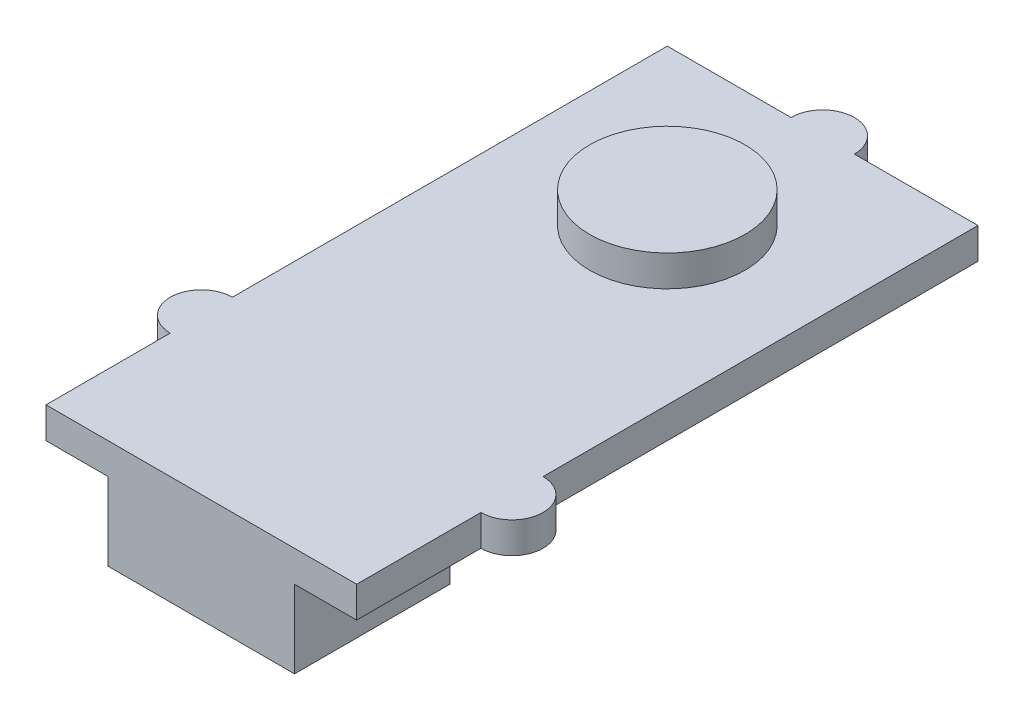
ISO-10303-21;
HEADER;
FILE_DESCRIPTION(('STEP AP214'),'2;1');
FILE_NAME('part.step','',(''),(''),'','','');
FILE_SCHEMA(('AUTOMOTIVE_DESIGN { 1 0 10303 214 1 1 1 1 }'));
ENDSEC;
DATA;
#1=APPLICATION_CONTEXT('core data for automotive mechanical design processes');
#2=APPLICATION_PROTOCOL_DEFINITION('international standard','automotive_design',2000,#1);
#3=PRODUCT_CONTEXT('',#1,'mechanical');
#4=PRODUCT('Part','Part','',(#3));
#5=PRODUCT_RELATED_PRODUCT_CATEGORY('part','',(#4));
#6=PRODUCT_DEFINITION_FORMATION('','',#4);
#7=PRODUCT_DEFINITION_CONTEXT('part definition',#1,'design');
#8=PRODUCT_DEFINITION('design','',#6,#7);
#9=PRODUCT_DEFINITION_SHAPE('','',#8);
#10=(LENGTH_UNIT() NAMED_UNIT(*) SI_UNIT(.MILLI.,.METRE.));
#11=(NAMED_UNIT(*) PLANE_ANGLE_UNIT() SI_UNIT($,.RADIAN.));
#12=(NAMED_UNIT(*) SI_UNIT($,.STERADIAN.) SOLID_ANGLE_UNIT());
#13=UNCERTAINTY_MEASURE_WITH_UNIT(LENGTH_MEASURE(1.E-05),#10,'distance_accuracy_value','');
#14=(GEOMETRIC_REPRESENTATION_CONTEXT(3) GLOBAL_UNCERTAINTY_ASSIGNED_CONTEXT((#13)) GLOBAL_UNIT_ASSIGNED_CONTEXT((#10,
#11,#12)) REPRESENTATION_CONTEXT('',''));
#15=CARTESIAN_POINT('',(0.,0.,0.));
#16=DIRECTION('',(0.,0.,1.));
#17=DIRECTION('',(1.,0.,0.));
#18=AXIS2_PLACEMENT_3D('',#15,#16,#17);
#19=CARTESIAN_POINT('',(-10.,0.,10.));
#20=DIRECTION('',(0.,1.,0.));
#21=DIRECTION('',(0.,0.,1.));
#22=AXIS2_PLACEMENT_3D('',#19,#20,#21);
#23=PLANE('',#22);
#24=DIRECTION('',(0.,0.,1.));
#25=VECTOR('',#24,1.);
#26=CARTESIAN_POINT('',(6.,0.,20.));
#27=LINE('',#26,#25);
#28=CARTESIAN_POINT('',(6.,0.,10.));
#29=VERTEX_POINT('',#28);
#30=CARTESIAN_POINT('',(6.,0.,20.));
#31=VERTEX_POINT('',#30);
#32=EDGE_CURVE('E55',#29,#31,#27,.T.);
#33=ORIENTED_EDGE('',*,*,#32,.F.);
#34=DIRECTION('',(1.,0.,0.));
#35=VECTOR('',#34,1.);
#36=CARTESIAN_POINT('',(6.,0.,10.));
#37=LINE('',#36,#35);
#38=CARTESIAN_POINT('',(-6.,0.,9.99999999999999));
#39=VERTEX_POINT('',#38);
#40=EDGE_CURVE('E161',#39,#29,#37,.T.);
#41=ORIENTED_EDGE('',*,*,#40,.F.);
#42=DIRECTION('',(0.,0.,-1.));
#43=VECTOR('',#42,1.);
#44=CARTESIAN_POINT('',(-6.,0.,20.));
#45=LINE('',#44,#43);
#46=CARTESIAN_POINT('',(-6.,0.,20.));
#47=VERTEX_POINT('',#46);
#48=EDGE_CURVE('E314',#47,#39,#45,.T.);
#49=ORIENTED_EDGE('',*,*,#48,.F.);
#50=DIRECTION('',(1.,0.,0.));
#51=VECTOR('',#50,1.);
#52=CARTESIAN_POINT('',(-10.,0.,20.));
#53=LINE('',#52,#51);
#54=CARTESIAN_POINT('',(-10.,0.,20.));
#55=VERTEX_POINT('',#54);
#56=EDGE_CURVE('E185',#55,#47,#53,.T.);
#57=ORIENTED_EDGE('',*,*,#56,.F.);
#58=DIRECTION('',(0.,0.,1.));
#59=VECTOR('',#58,1.);
#60=CARTESIAN_POINT('',(-10.,0.,12.));
#61=LINE('',#60,#59);
#62=CARTESIAN_POINT('',(-10.,0.,12.));
#63=VERTEX_POINT('',#62);
#64=EDGE_CURVE('E237',#63,#55,#61,.T.);
#65=ORIENTED_EDGE('',*,*,#64,.F.);
#66=CARTESIAN_POINT('',(-10.,0.,10.));
#67=DIRECTION('',(0.,1.,0.));
#68=DIRECTION('',(0.,0.,1.));
#69=AXIS2_PLACEMENT_3D('',#66,#67,#68);
#70=CIRCLE('',#69,2.);
#71=CARTESIAN_POINT('',(-10.,0.,8.));
#72=VERTEX_POINT('',#71);
#73=EDGE_CURVE('E234',#72,#63,#70,.T.);
#74=ORIENTED_EDGE('',*,*,#73,.F.);
#75=DIRECTION('',(0.,0.,1.));
#76=VECTOR('',#75,1.);
#77=CARTESIAN_POINT('',(-10.,0.,-20.));
#78=LINE('',#77,#76);
#79=CARTESIAN_POINT('',(-10.,0.,-20.));
#80=VERTEX_POINT('',#79);
#81=EDGE_CURVE('E231',#80,#72,#78,.T.);
#82=ORIENTED_EDGE('',*,*,#81,.F.);
#83=DIRECTION('',(-1.,0.,0.));
#84=VECTOR('',#83,1.);
#85=CARTESIAN_POINT('',(-10.,0.,-20.));
#86=LINE('',#85,#84);
#87=CARTESIAN_POINT('',(-2.04333698626598,0.,-20.));
#88=VERTEX_POINT('',#87);
#89=EDGE_CURVE('E228',#88,#80,#86,.T.);
#90=ORIENTED_EDGE('',*,*,#89,.F.);
#91=CARTESIAN_POINT('',(0.,0.,-20.));
#92=DIRECTION('',(0.,1.,0.));
#93=DIRECTION('',(0.,0.,1.));
#94=AXIS2_PLACEMENT_3D('',#91,#92,#93);
#95=CIRCLE('',#94,2.04333698626598);
#96=CARTESIAN_POINT('',(2.04333698626597,0.,-20.));
#97=VERTEX_POINT('',#96);
#98=EDGE_CURVE('E225',#97,#88,#95,.T.);
#99=ORIENTED_EDGE('',*,*,#98,.F.);
#100=DIRECTION('',(-1.,0.,0.));
#101=VECTOR('',#100,1.);
#102=CARTESIAN_POINT('',(2.04333698626597,0.,-20.));
#103=LINE('',#102,#101);
#104=CARTESIAN_POINT('',(9.99999999999999,0.,-20.));
#105=VERTEX_POINT('',#104);
#106=EDGE_CURVE('E222',#105,#97,#103,.T.);
#107=ORIENTED_EDGE('',*,*,#106,.F.);
#108=DIRECTION('',(0.,0.,-1.));
#109=VECTOR('',#108,1.);
#110=CARTESIAN_POINT('',(9.99999999999999,0.,-20.));
#111=LINE('',#110,#109);
#112=CARTESIAN_POINT('',(10.,0.,7.99999999999999));
#113=VERTEX_POINT('',#112);
#114=EDGE_CURVE('E219',#113,#105,#111,.T.);
#115=ORIENTED_EDGE('',*,*,#114,.F.);
#116=CARTESIAN_POINT('',(10.,0.,9.99999999999999));
#117=DIRECTION('',(0.,1.,0.));
#118=DIRECTION('',(0.,0.,1.));
#119=AXIS2_PLACEMENT_3D('',#116,#117,#118);
#120=CIRCLE('',#119,2.);
#121=CARTESIAN_POINT('',(10.,0.,12.));
#122=VERTEX_POINT('',#121);
#123=EDGE_CURVE('E216',#122,#113,#120,.T.);
#124=ORIENTED_EDGE('',*,*,#123,.F.);
#125=DIRECTION('',(0.,0.,-1.));
#126=VECTOR('',#125,1.);
#127=CARTESIAN_POINT('',(10.,0.,12.));
#128=LINE('',#127,#126);
#129=CARTESIAN_POINT('',(10.,0.,20.));
#130=VERTEX_POINT('',#129);
#131=EDGE_CURVE('E178',#130,#122,#128,.T.);
#132=ORIENTED_EDGE('',*,*,#131,.F.);
#133=EDGE_CURVE('E60',#31,#130,#53,.T.);
#134=ORIENTED_EDGE('',*,*,#133,.F.);
#135=EDGE_LOOP('',(#33,#41,#49,#57,#65,#74,#82,#90,#99,#107,#115,#124,#132,#134));
#136=FACE_BOUND('',#135,.T.);
#137=ADVANCED_FACE('F39',(#136),#23,.F.);
#138=CARTESIAN_POINT('',(10.,2.,12.));
#139=DIRECTION('',(-1.,0.,0.));
#140=DIRECTION('',(0.,0.,1.));
#141=AXIS2_PLACEMENT_3D('',#138,#139,#140);
#142=PLANE('',#141);
#143=ORIENTED_EDGE('',*,*,#131,.T.);
#144=DIRECTION('',(0.,-1.,0.));
#145=VECTOR('',#144,1.);
#146=CARTESIAN_POINT('',(10.,2.,12.));
#147=LINE('',#146,#145);
#148=CARTESIAN_POINT('',(10.,2.,12.));
#149=VERTEX_POINT('',#148);
#150=EDGE_CURVE('E11',#149,#122,#147,.T.);
#151=ORIENTED_EDGE('',*,*,#150,.F.);
#152=DIRECTION('',(0.,0.,-1.));
#153=VECTOR('',#152,1.);
#154=CARTESIAN_POINT('',(10.,2.,12.));
#155=LINE('',#154,#153);
#156=CARTESIAN_POINT('',(10.,2.,20.));
#157=VERTEX_POINT('',#156);
#158=EDGE_CURVE('E180',#157,#149,#155,.T.);
#159=ORIENTED_EDGE('',*,*,#158,.F.);
#160=DIRECTION('',(0.,-1.,0.));
#161=VECTOR('',#160,1.);
#162=CARTESIAN_POINT('',(10.,2.,20.));
#163=LINE('',#162,#161);
#164=EDGE_CURVE('E212',#157,#130,#163,.T.);
#165=ORIENTED_EDGE('',*,*,#164,.T.);
#166=EDGE_LOOP('',(#143,#151,#159,#165));
#167=FACE_BOUND('',#166,.T.);
#168=ADVANCED_FACE('F41',(#167),#142,.F.);
#169=CARTESIAN_POINT('',(10.,2.,9.99999999999999));
#170=DIRECTION('',(0.,-1.,0.));
#171=DIRECTION('',(0.,0.,-1.));
#172=AXIS2_PLACEMENT_3D('',#169,#170,#171);
#173=CYLINDRICAL_SURFACE('',#172,2.);
#174=ORIENTED_EDGE('',*,*,#123,.T.);
#175=DIRECTION('',(0.,-1.,0.));
#176=VECTOR('',#175,1.);
#177=CARTESIAN_POINT('',(10.,2.,7.99999999999999));
#178=LINE('',#177,#176);
#179=CARTESIAN_POINT('',(10.,2.,7.99999999999999));
#180=VERTEX_POINT('',#179);
#181=EDGE_CURVE('E48',#180,#113,#178,.T.);
#182=ORIENTED_EDGE('',*,*,#181,.F.);
#183=CARTESIAN_POINT('',(10.,2.,9.99999999999999));
#184=DIRECTION('',(0.,1.,0.));
#185=DIRECTION('',(0.,0.,1.));
#186=AXIS2_PLACEMENT_3D('',#183,#184,#185);
#187=CIRCLE('',#186,2.);
#188=EDGE_CURVE('E184',#149,#180,#187,.T.);
#189=ORIENTED_EDGE('',*,*,#188,.F.);
#190=ORIENTED_EDGE('',*,*,#150,.T.);
#191=EDGE_LOOP('',(#174,#182,#189,#190));
#192=FACE_BOUND('',#191,.T.);
#193=ADVANCED_FACE('F298',(#192),#173,.T.);
#194=CARTESIAN_POINT('',(9.99999999999999,2.,-20.));
#195=DIRECTION('',(-1.,0.,0.));
#196=DIRECTION('',(0.,0.,1.));
#197=AXIS2_PLACEMENT_3D('',#194,#195,#196);
#198=PLANE('',#197);
#199=ORIENTED_EDGE('',*,*,#114,.T.);
#200=DIRECTION('',(0.,-1.,0.));
#201=VECTOR('',#200,1.);
#202=CARTESIAN_POINT('',(9.99999999999999,2.,-20.));
#203=LINE('',#202,#201);
#204=CARTESIAN_POINT('',(9.99999999999999,2.,-20.));
#205=VERTEX_POINT('',#204);
#206=EDGE_CURVE('E269',#205,#105,#203,.T.);
#207=ORIENTED_EDGE('',*,*,#206,.F.);
#208=DIRECTION('',(0.,0.,-1.));
#209=VECTOR('',#208,1.);
#210=CARTESIAN_POINT('',(9.99999999999999,2.,-20.));
#211=LINE('',#210,#209);
#212=EDGE_CURVE('E188',#180,#205,#211,.T.);
#213=ORIENTED_EDGE('',*,*,#212,.F.);
#214=ORIENTED_EDGE('',*,*,#181,.T.);
#215=EDGE_LOOP('',(#199,#207,#213,#214));
#216=FACE_BOUND('',#215,.T.);
#217=ADVANCED_FACE('F278',(#216),#198,.F.);
#218=CARTESIAN_POINT('',(2.04333698626597,2.,-20.));
#219=DIRECTION('',(0.,0.,1.));
#220=DIRECTION('',(1.,0.,0.));
#221=AXIS2_PLACEMENT_3D('',#218,#219,#220);
#222=PLANE('',#221);
#223=ORIENTED_EDGE('',*,*,#106,.T.);
#224=DIRECTION('',(0.,-1.,0.));
#225=VECTOR('',#224,1.);
#226=CARTESIAN_POINT('',(2.04333698626597,2.,-20.));
#227=LINE('',#226,#225);
#228=CARTESIAN_POINT('',(2.04333698626597,2.,-20.));
#229=VERTEX_POINT('',#228);
#230=EDGE_CURVE('E265',#229,#97,#227,.T.);
#231=ORIENTED_EDGE('',*,*,#230,.F.);
#232=DIRECTION('',(-1.,0.,0.));
#233=VECTOR('',#232,1.);
#234=CARTESIAN_POINT('',(2.04333698626597,2.,-20.));
#235=LINE('',#234,#233);
#236=EDGE_CURVE('E191',#205,#229,#235,.T.);
#237=ORIENTED_EDGE('',*,*,#236,.F.);
#238=ORIENTED_EDGE('',*,*,#206,.T.);
#239=EDGE_LOOP('',(#223,#231,#237,#238));
#240=FACE_BOUND('',#239,.T.);
#241=ADVANCED_FACE('F286',(#240),#222,.F.);
#242=CARTESIAN_POINT('',(0.,2.,-20.));
#243=DIRECTION('',(0.,-1.,0.));
#244=DIRECTION('',(0.,0.,-1.));
#245=AXIS2_PLACEMENT_3D('',#242,#243,#244);
#246=CYLINDRICAL_SURFACE('',#245,2.04333698626598);
#247=ORIENTED_EDGE('',*,*,#98,.T.);
#248=DIRECTION('',(0.,-1.,0.));
#249=VECTOR('',#248,1.);
#250=CARTESIAN_POINT('',(-2.04333698626598,2.,-20.));
#251=LINE('',#250,#249);
#252=CARTESIAN_POINT('',(-2.04333698626598,2.,-20.));
#253=VERTEX_POINT('',#252);
#254=EDGE_CURVE('E261',#253,#88,#251,.T.);
#255=ORIENTED_EDGE('',*,*,#254,.F.);
#256=CARTESIAN_POINT('',(0.,2.,-20.));
#257=DIRECTION('',(0.,1.,0.));
#258=DIRECTION('',(0.,0.,1.));
#259=AXIS2_PLACEMENT_3D('',#256,#257,#258);
#260=CIRCLE('',#259,2.04333698626598);
#261=EDGE_CURVE('E194',#229,#253,#260,.T.);
#262=ORIENTED_EDGE('',*,*,#261,.F.);
#263=ORIENTED_EDGE('',*,*,#230,.T.);
#264=EDGE_LOOP('',(#247,#255,#262,#263));
#265=FACE_BOUND('',#264,.T.);
#266=ADVANCED_FACE('F290',(#265),#246,.T.);
#267=CARTESIAN_POINT('',(-10.,2.,-20.));
#268=DIRECTION('',(0.,0.,1.));
#269=DIRECTION('',(1.,0.,0.));
#270=AXIS2_PLACEMENT_3D('',#267,#268,#269);
#271=PLANE('',#270);
#272=ORIENTED_EDGE('',*,*,#89,.T.);
#273=DIRECTION('',(0.,-1.,0.));
#274=VECTOR('',#273,1.);
#275=CARTESIAN_POINT('',(-10.,2.,-20.));
#276=LINE('',#275,#274);
#277=CARTESIAN_POINT('',(-10.,2.,-20.));
#278=VERTEX_POINT('',#277);
#279=EDGE_CURVE('E257',#278,#80,#276,.T.);
#280=ORIENTED_EDGE('',*,*,#279,.F.);
#281=DIRECTION('',(-1.,0.,0.));
#282=VECTOR('',#281,1.);
#283=CARTESIAN_POINT('',(-10.,2.,-20.));
#284=LINE('',#283,#282);
#285=EDGE_CURVE('E197',#253,#278,#284,.T.);
#286=ORIENTED_EDGE('',*,*,#285,.F.);
#287=ORIENTED_EDGE('',*,*,#254,.T.);
#288=EDGE_LOOP('',(#272,#280,#286,#287));
#289=FACE_BOUND('',#288,.T.);
#290=ADVANCED_FACE('F362',(#289),#271,.F.);
#291=CARTESIAN_POINT('',(-10.,2.,-20.));
#292=DIRECTION('',(1.,0.,0.));
#293=DIRECTION('',(0.,0.,-1.));
#294=AXIS2_PLACEMENT_3D('',#291,#292,#293);
#295=PLANE('',#294);
#296=ORIENTED_EDGE('',*,*,#81,.T.);
#297=DIRECTION('',(0.,-1.,0.));
#298=VECTOR('',#297,1.);
#299=CARTESIAN_POINT('',(-10.,2.,8.));
#300=LINE('',#299,#298);
#301=CARTESIAN_POINT('',(-10.,2.,8.));
#302=VERTEX_POINT('',#301);
#303=EDGE_CURVE('E253',#302,#72,#300,.T.);
#304=ORIENTED_EDGE('',*,*,#303,.F.);
#305=DIRECTION('',(0.,0.,1.));
#306=VECTOR('',#305,1.);
#307=CARTESIAN_POINT('',(-10.,2.,-20.));
#308=LINE('',#307,#306);
#309=EDGE_CURVE('E200',#278,#302,#308,.T.);
#310=ORIENTED_EDGE('',*,*,#309,.F.);
#311=ORIENTED_EDGE('',*,*,#279,.T.);
#312=EDGE_LOOP('',(#296,#304,#310,#311));
#313=FACE_BOUND('',#312,.T.);
#314=ADVANCED_FACE('F358',(#313),#295,.F.);
#315=CARTESIAN_POINT('',(-10.,2.,10.));
#316=DIRECTION('',(0.,-1.,0.));
#317=DIRECTION('',(0.,0.,-1.));
#318=AXIS2_PLACEMENT_3D('',#315,#316,#317);
#319=CYLINDRICAL_SURFACE('',#318,2.);
#320=ORIENTED_EDGE('',*,*,#73,.T.);
#321=DIRECTION('',(0.,-1.,0.));
#322=VECTOR('',#321,1.);
#323=CARTESIAN_POINT('',(-10.,2.,12.));
#324=LINE('',#323,#322);
#325=CARTESIAN_POINT('',(-10.,2.,12.));
#326=VERTEX_POINT('',#325);
#327=EDGE_CURVE('E249',#326,#63,#324,.T.);
#328=ORIENTED_EDGE('',*,*,#327,.F.);
#329=CARTESIAN_POINT('',(-10.,2.,10.));
#330=DIRECTION('',(0.,1.,0.));
#331=DIRECTION('',(0.,0.,1.));
#332=AXIS2_PLACEMENT_3D('',#329,#330,#331);
#333=CIRCLE('',#332,2.);
#334=EDGE_CURVE('E203',#302,#326,#333,.T.);
#335=ORIENTED_EDGE('',*,*,#334,.F.);
#336=ORIENTED_EDGE('',*,*,#303,.T.);
#337=EDGE_LOOP('',(#320,#328,#335,#336));
#338=FACE_BOUND('',#337,.T.);
#339=ADVANCED_FACE('F355',(#338),#319,.T.);
#340=CARTESIAN_POINT('',(-10.,2.,12.));
#341=DIRECTION('',(1.,0.,0.));
#342=DIRECTION('',(0.,0.,-1.));
#343=AXIS2_PLACEMENT_3D('',#340,#341,#342);
#344=PLANE('',#343);
#345=ORIENTED_EDGE('',*,*,#64,.T.);
#346=DIRECTION('',(0.,-1.,0.));
#347=VECTOR('',#346,1.);
#348=CARTESIAN_POINT('',(-10.,2.,20.));
#349=LINE('',#348,#347);
#350=CARTESIAN_POINT('',(-10.,2.,20.));
#351=VERTEX_POINT('',#350);
#352=EDGE_CURVE('E245',#351,#55,#349,.T.);
#353=ORIENTED_EDGE('',*,*,#352,.F.);
#354=DIRECTION('',(0.,0.,1.));
#355=VECTOR('',#354,1.);
#356=CARTESIAN_POINT('',(-10.,2.,12.));
#357=LINE('',#356,#355);
#358=EDGE_CURVE('E206',#326,#351,#357,.T.);
#359=ORIENTED_EDGE('',*,*,#358,.F.);
#360=ORIENTED_EDGE('',*,*,#327,.T.);
#361=EDGE_LOOP('',(#345,#353,#359,#360));
#362=FACE_BOUND('',#361,.T.);
#363=ADVANCED_FACE('F309',(#362),#344,.F.);
#364=CARTESIAN_POINT('',(-10.,2.,20.));
#365=DIRECTION('',(0.,0.,-1.));
#366=DIRECTION('',(-1.,0.,0.));
#367=AXIS2_PLACEMENT_3D('',#364,#365,#366);
#368=PLANE('',#367);
#369=ORIENTED_EDGE('',*,*,#56,.T.);
#370=DIRECTION('',(0.,1.,0.));
#371=VECTOR('',#370,1.);
#372=CARTESIAN_POINT('',(-6.,-5.,20.));
#373=LINE('',#372,#371);
#374=CARTESIAN_POINT('',(-6.,-5.,20.));
#375=VERTEX_POINT('',#374);
#376=EDGE_CURVE('E146',#375,#47,#373,.T.);
#377=ORIENTED_EDGE('',*,*,#376,.F.);
#378=DIRECTION('',(-1.,0.,0.));
#379=VECTOR('',#378,1.);
#380=CARTESIAN_POINT('',(6.,-5.,20.));
#381=LINE('',#380,#379);
#382=CARTESIAN_POINT('',(6.,-5.,20.));
#383=VERTEX_POINT('',#382);
#384=EDGE_CURVE('E139',#383,#375,#381,.T.);
#385=ORIENTED_EDGE('',*,*,#384,.F.);
#386=DIRECTION('',(0.,1.,0.));
#387=VECTOR('',#386,1.);
#388=CARTESIAN_POINT('',(6.,-5.,20.));
#389=LINE('',#388,#387);
#390=EDGE_CURVE('E144',#383,#31,#389,.T.);
#391=ORIENTED_EDGE('',*,*,#390,.T.);
#392=ORIENTED_EDGE('',*,*,#133,.T.);
#393=ORIENTED_EDGE('',*,*,#164,.F.);
#394=DIRECTION('',(1.,0.,0.));
#395=VECTOR('',#394,1.);
#396=CARTESIAN_POINT('',(-10.,2.,20.));
#397=LINE('',#396,#395);
#398=EDGE_CURVE('E209',#351,#157,#397,.T.);
#399=ORIENTED_EDGE('',*,*,#398,.F.);
#400=ORIENTED_EDGE('',*,*,#352,.T.);
#401=EDGE_LOOP('',(#369,#377,#385,#391,#392,#393,#399,#400));
#402=FACE_BOUND('',#401,.T.);
#403=ADVANCED_FACE('F142',(#402),#368,.F.);
#404=CARTESIAN_POINT('',(-10.,2.,10.));
#405=DIRECTION('',(0.,1.,0.));
#406=DIRECTION('',(0.,0.,1.));
#407=AXIS2_PLACEMENT_3D('',#404,#405,#406);
#408=PLANE('',#407);
#409=CARTESIAN_POINT('',(0.,2.,-10.));
#410=DIRECTION('',(0.,1.,0.));
#411=DIRECTION('',(0.,0.,1.));
#412=AXIS2_PLACEMENT_3D('',#409,#410,#411);
#413=CIRCLE('',#412,5.);
#414=CARTESIAN_POINT('',(0.,2.,-5.));
#415=VERTEX_POINT('',#414);
#416=EDGE_CURVE('E165',#415,#415,#413,.T.);
#417=ORIENTED_EDGE('',*,*,#416,.F.);
#418=EDGE_LOOP('',(#417));
#419=FACE_BOUND('',#418,.T.);
#420=ORIENTED_EDGE('',*,*,#158,.T.);
#421=ORIENTED_EDGE('',*,*,#188,.T.);
#422=ORIENTED_EDGE('',*,*,#212,.T.);
#423=ORIENTED_EDGE('',*,*,#236,.T.);
#424=ORIENTED_EDGE('',*,*,#261,.T.);
#425=ORIENTED_EDGE('',*,*,#285,.T.);
#426=ORIENTED_EDGE('',*,*,#309,.T.);
#427=ORIENTED_EDGE('',*,*,#334,.T.);
#428=ORIENTED_EDGE('',*,*,#358,.T.);
#429=ORIENTED_EDGE('',*,*,#398,.T.);
#430=EDGE_LOOP('',(#420,#421,#422,#423,#424,#425,#426,#427,#428,#429));
#431=FACE_BOUND('',#430,.T.);
#432=ADVANCED_FACE('F294',(#419,#431),#408,.T.);
#433=CARTESIAN_POINT('',(0.,4.,-10.));
#434=DIRECTION('',(0.,-1.,0.));
#435=DIRECTION('',(0.,0.,-1.));
#436=AXIS2_PLACEMENT_3D('',#433,#434,#435);
#437=CYLINDRICAL_SURFACE('',#436,5.);
#438=CARTESIAN_POINT('',(0.,4.,-10.));
#439=DIRECTION('',(0.,1.,0.));
#440=DIRECTION('',(0.,0.,1.));
#441=AXIS2_PLACEMENT_3D('',#438,#439,#440);
#442=CIRCLE('',#441,5.);
#443=CARTESIAN_POINT('',(0.,4.,-5.));
#444=VERTEX_POINT('',#443);
#445=EDGE_CURVE('E170',#444,#444,#442,.T.);
#446=ORIENTED_EDGE('',*,*,#445,.F.);
#447=EDGE_LOOP('',(#446));
#448=FACE_BOUND('',#447,.T.);
#449=ORIENTED_EDGE('',*,*,#416,.T.);
#450=EDGE_LOOP('',(#449));
#451=FACE_BOUND('',#450,.T.);
#452=ADVANCED_FACE('F416',(#448,#451),#437,.T.);
#453=CARTESIAN_POINT('',(0.,4.,-10.));
#454=DIRECTION('',(0.,1.,0.));
#455=DIRECTION('',(0.,0.,1.));
#456=AXIS2_PLACEMENT_3D('',#453,#454,#455);
#457=PLANE('',#456);
#458=ORIENTED_EDGE('',*,*,#445,.T.);
#459=EDGE_LOOP('',(#458));
#460=FACE_BOUND('',#459,.T.);
#461=ADVANCED_FACE('F423',(#460),#457,.T.);
#462=CARTESIAN_POINT('',(6.,-5.,20.));
#463=DIRECTION('',(-1.,0.,0.));
#464=DIRECTION('',(0.,0.,1.));
#465=AXIS2_PLACEMENT_3D('',#462,#463,#464);
#466=PLANE('',#465);
#467=ORIENTED_EDGE('',*,*,#32,.T.);
#468=ORIENTED_EDGE('',*,*,#390,.F.);
#469=DIRECTION('',(0.,0.,1.));
#470=VECTOR('',#469,1.);
#471=CARTESIAN_POINT('',(6.,-5.,20.));
#472=LINE('',#471,#470);
#473=CARTESIAN_POINT('',(6.,-5.,10.));
#474=VERTEX_POINT('',#473);
#475=EDGE_CURVE('E151',#474,#383,#472,.T.);
#476=ORIENTED_EDGE('',*,*,#475,.F.);
#477=DIRECTION('',(0.,1.,0.));
#478=VECTOR('',#477,1.);
#479=CARTESIAN_POINT('',(6.,-5.,10.));
#480=LINE('',#479,#478);
#481=EDGE_CURVE('E322',#474,#29,#480,.T.);
#482=ORIENTED_EDGE('',*,*,#481,.T.);
#483=EDGE_LOOP('',(#467,#468,#476,#482));
#484=FACE_BOUND('',#483,.T.);
#485=ADVANCED_FACE('F163',(#484),#466,.F.);
#486=CARTESIAN_POINT('',(-6.,-5.,20.));
#487=DIRECTION('',(1.,0.,0.));
#488=DIRECTION('',(0.,0.,-1.));
#489=AXIS2_PLACEMENT_3D('',#486,#487,#488);
#490=PLANE('',#489);
#491=ORIENTED_EDGE('',*,*,#48,.T.);
#492=DIRECTION('',(0.,1.,0.));
#493=VECTOR('',#492,1.);
#494=CARTESIAN_POINT('',(-6.,-5.,9.99999999999999));
#495=LINE('',#494,#493);
#496=CARTESIAN_POINT('',(-6.,-5.,9.99999999999999));
#497=VERTEX_POINT('',#496);
#498=EDGE_CURVE('E172',#497,#39,#495,.T.);
#499=ORIENTED_EDGE('',*,*,#498,.F.);
#500=DIRECTION('',(0.,0.,-1.));
#501=VECTOR('',#500,1.);
#502=CARTESIAN_POINT('',(-6.,-5.,20.));
#503=LINE('',#502,#501);
#504=EDGE_CURVE('E150',#375,#497,#503,.T.);
#505=ORIENTED_EDGE('',*,*,#504,.F.);
#506=ORIENTED_EDGE('',*,*,#376,.T.);
#507=EDGE_LOOP('',(#491,#499,#505,#506));
#508=FACE_BOUND('',#507,.T.);
#509=ADVANCED_FACE('F316',(#508),#490,.F.);
#510=CARTESIAN_POINT('',(6.,-5.,10.));
#511=DIRECTION('',(0.,0.,1.));
#512=DIRECTION('',(1.,0.,0.));
#513=AXIS2_PLACEMENT_3D('',#510,#511,#512);
#514=PLANE('',#513);
#515=ORIENTED_EDGE('',*,*,#40,.T.);
#516=ORIENTED_EDGE('',*,*,#481,.F.);
#517=DIRECTION('',(1.,0.,0.));
#518=VECTOR('',#517,1.);
#519=CARTESIAN_POINT('',(6.,-5.,10.));
#520=LINE('',#519,#518);
#521=EDGE_CURVE('E156',#497,#474,#520,.T.);
#522=ORIENTED_EDGE('',*,*,#521,.F.);
#523=ORIENTED_EDGE('',*,*,#498,.T.);
#524=EDGE_LOOP('',(#515,#516,#522,#523));
#525=FACE_BOUND('',#524,.T.);
#526=ADVANCED_FACE('F334',(#525),#514,.F.);
#527=CARTESIAN_POINT('',(0.,-5.,0.));
#528=DIRECTION('',(0.,1.,0.));
#529=DIRECTION('',(0.,0.,1.));
#530=AXIS2_PLACEMENT_3D('',#527,#528,#529);
#531=PLANE('',#530);
#532=ORIENTED_EDGE('',*,*,#475,.T.);
#533=ORIENTED_EDGE('',*,*,#384,.T.);
#534=ORIENTED_EDGE('',*,*,#504,.T.);
#535=ORIENTED_EDGE('',*,*,#521,.T.);
#536=EDGE_LOOP('',(#532,#533,#534,#535));
#537=FACE_BOUND('',#536,.T.);
#538=ADVANCED_FACE('F154',(#537),#531,.F.);
#539=CLOSED_SHELL('',(#137,#168,#193,#217,#241,#266,#290,#314,#339,#363,#403,#432,#452,#461,
#485,#509,#526,#538));
#540=MANIFOLD_SOLID_BREP('B2',#539);
#541=ADVANCED_BREP_SHAPE_REPRESENTATION('',(#18,#540),#14);
#542=SHAPE_DEFINITION_REPRESENTATION(#9,#541);
ENDSEC;
END-ISO-10303-21;
